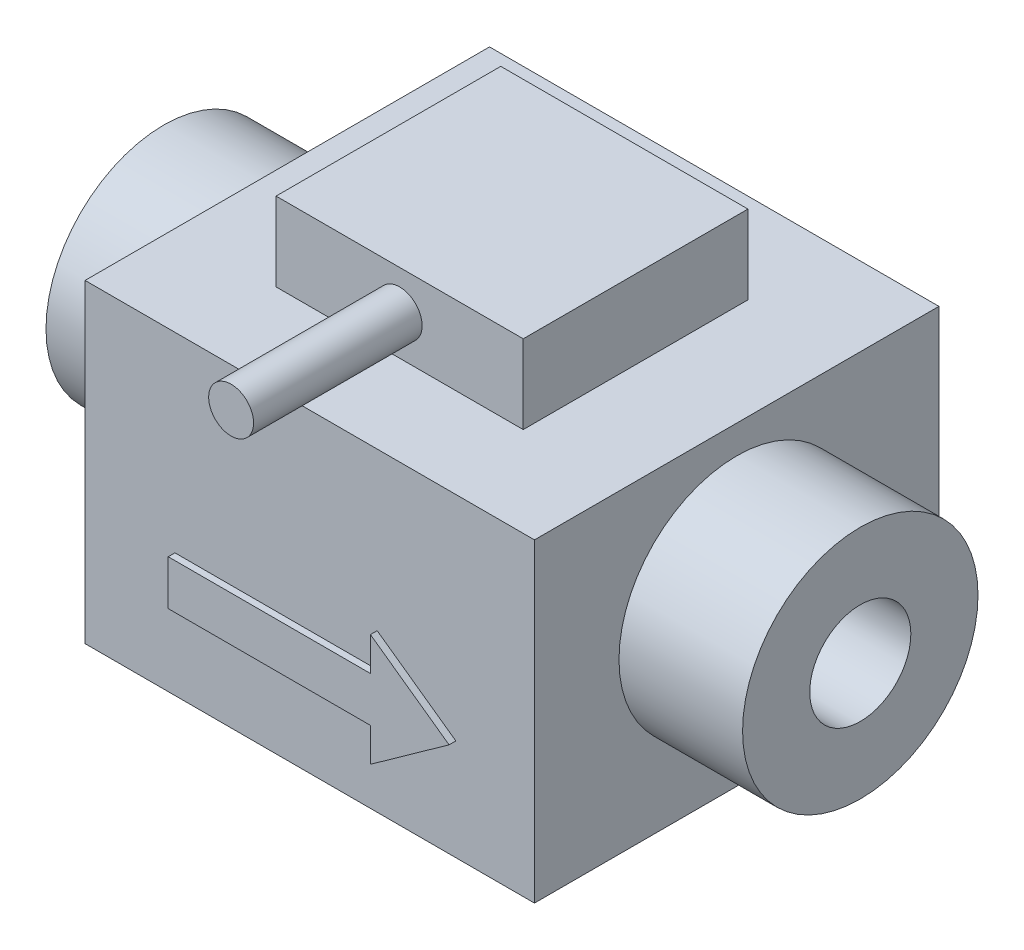
ISO-10303-21;
HEADER;
FILE_DESCRIPTION(('STEP AP214'),'2;1');
FILE_NAME('part.step','',(''),(''),'','','');
FILE_SCHEMA(('AUTOMOTIVE_DESIGN { 1 0 10303 214 1 1 1 1 }'));
ENDSEC;
DATA;
#1=APPLICATION_CONTEXT('core data for automotive mechanical design processes');
#2=APPLICATION_PROTOCOL_DEFINITION('international standard','automotive_design',2000,#1);
#3=PRODUCT_CONTEXT('',#1,'mechanical');
#4=PRODUCT('Part','Part','',(#3));
#5=PRODUCT_RELATED_PRODUCT_CATEGORY('part','',(#4));
#6=PRODUCT_DEFINITION_FORMATION('','',#4);
#7=PRODUCT_DEFINITION_CONTEXT('part definition',#1,'design');
#8=PRODUCT_DEFINITION('design','',#6,#7);
#9=PRODUCT_DEFINITION_SHAPE('','',#8);
#10=(LENGTH_UNIT() NAMED_UNIT(*) SI_UNIT(.MILLI.,.METRE.));
#11=(NAMED_UNIT(*) PLANE_ANGLE_UNIT() SI_UNIT($,.RADIAN.));
#12=(NAMED_UNIT(*) SI_UNIT($,.STERADIAN.) SOLID_ANGLE_UNIT());
#13=UNCERTAINTY_MEASURE_WITH_UNIT(LENGTH_MEASURE(1.E-05),#10,'distance_accuracy_value','');
#14=(GEOMETRIC_REPRESENTATION_CONTEXT(3) GLOBAL_UNCERTAINTY_ASSIGNED_CONTEXT((#13)) GLOBAL_UNIT_ASSIGNED_CONTEXT((#10,
#11,#12)) REPRESENTATION_CONTEXT('',''));
#15=CARTESIAN_POINT('',(0.,0.,0.));
#16=DIRECTION('',(0.,0.,1.));
#17=DIRECTION('',(1.,0.,0.));
#18=AXIS2_PLACEMENT_3D('',#15,#16,#17);
#19=CARTESIAN_POINT('',(-20.,28.,18.));
#20=DIRECTION('',(0.,0.,-1.));
#21=DIRECTION('',(-1.,0.,0.));
#22=AXIS2_PLACEMENT_3D('',#19,#20,#21);
#23=PLANE('',#22);
#24=DIRECTION('',(1.,0.,0.));
#25=VECTOR('',#24,1.);
#26=CARTESIAN_POINT('',(-20.,0.,18.));
#27=LINE('',#26,#25);
#28=CARTESIAN_POINT('',(-20.,0.,18.));
#29=VERTEX_POINT('',#28);
#30=CARTESIAN_POINT('',(20.,0.,18.));
#31=VERTEX_POINT('',#30);
#32=EDGE_CURVE('E242',#29,#31,#27,.T.);
#33=ORIENTED_EDGE('',*,*,#32,.T.);
#34=DIRECTION('',(0.,-1.,0.));
#35=VECTOR('',#34,1.);
#36=CARTESIAN_POINT('',(20.,28.,18.));
#37=LINE('',#36,#35);
#38=CARTESIAN_POINT('',(20.,28.,18.));
#39=VERTEX_POINT('',#38);
#40=EDGE_CURVE('E249',#39,#31,#37,.T.);
#41=ORIENTED_EDGE('',*,*,#40,.F.);
#42=DIRECTION('',(1.,0.,0.));
#43=VECTOR('',#42,1.);
#44=CARTESIAN_POINT('',(-20.,28.,18.));
#45=LINE('',#44,#43);
#46=CARTESIAN_POINT('',(-20.,28.,18.));
#47=VERTEX_POINT('',#46);
#48=EDGE_CURVE('E247',#47,#39,#45,.T.);
#49=ORIENTED_EDGE('',*,*,#48,.F.);
#50=DIRECTION('',(0.,-1.,0.));
#51=VECTOR('',#50,1.);
#52=CARTESIAN_POINT('',(-20.,28.,18.));
#53=LINE('',#52,#51);
#54=EDGE_CURVE('E258',#47,#29,#53,.T.);
#55=ORIENTED_EDGE('',*,*,#54,.T.);
#56=EDGE_LOOP('',(#33,#41,#49,#55));
#57=FACE_BOUND('',#56,.T.);
#58=DIRECTION('',(0.,-1.,0.));
#59=VECTOR('',#58,1.);
#60=CARTESIAN_POINT('',(-12.,11.,18.));
#61=LINE('',#60,#59);
#62=CARTESIAN_POINT('',(-12.,11.,18.));
#63=VERTEX_POINT('',#62);
#64=CARTESIAN_POINT('',(-12.,7.,18.));
#65=VERTEX_POINT('',#64);
#66=EDGE_CURVE('E65',#63,#65,#61,.T.);
#67=ORIENTED_EDGE('',*,*,#66,.F.);
#68=DIRECTION('',(-1.,0.,0.));
#69=VECTOR('',#68,1.);
#70=CARTESIAN_POINT('',(6.,11.,18.));
#71=LINE('',#70,#69);
#72=CARTESIAN_POINT('',(6.,11.,18.));
#73=VERTEX_POINT('',#72);
#74=EDGE_CURVE('E66',#73,#63,#71,.T.);
#75=ORIENTED_EDGE('',*,*,#74,.F.);
#76=DIRECTION('',(0.,-1.,0.));
#77=VECTOR('',#76,1.);
#78=CARTESIAN_POINT('',(6.,14.,18.));
#79=LINE('',#78,#77);
#80=CARTESIAN_POINT('',(6.,14.,18.));
#81=VERTEX_POINT('',#80);
#82=EDGE_CURVE('E576',#81,#73,#79,.T.);
#83=ORIENTED_EDGE('',*,*,#82,.F.);
#84=DIRECTION('',(-0.813733471206735,0.581238193719096,0.));
#85=VECTOR('',#84,1.);
#86=CARTESIAN_POINT('',(13.,9.,18.));
#87=LINE('',#86,#85);
#88=CARTESIAN_POINT('',(13.,9.,18.));
#89=VERTEX_POINT('',#88);
#90=EDGE_CURVE('E604',#89,#81,#87,.T.);
#91=ORIENTED_EDGE('',*,*,#90,.F.);
#92=DIRECTION('',(0.813733471206735,0.581238193719096,0.));
#93=VECTOR('',#92,1.);
#94=CARTESIAN_POINT('',(6.,4.,18.));
#95=LINE('',#94,#93);
#96=CARTESIAN_POINT('',(6.,4.,18.));
#97=VERTEX_POINT('',#96);
#98=EDGE_CURVE('E600',#97,#89,#95,.T.);
#99=ORIENTED_EDGE('',*,*,#98,.F.);
#100=DIRECTION('',(0.,-1.,0.));
#101=VECTOR('',#100,1.);
#102=CARTESIAN_POINT('',(6.,7.,18.));
#103=LINE('',#102,#101);
#104=CARTESIAN_POINT('',(6.,7.,18.));
#105=VERTEX_POINT('',#104);
#106=EDGE_CURVE('E598',#105,#97,#103,.T.);
#107=ORIENTED_EDGE('',*,*,#106,.F.);
#108=DIRECTION('',(1.,0.,0.));
#109=VECTOR('',#108,1.);
#110=CARTESIAN_POINT('',(-12.,7.,18.));
#111=LINE('',#110,#109);
#112=EDGE_CURVE('E602',#65,#105,#111,.T.);
#113=ORIENTED_EDGE('',*,*,#112,.F.);
#114=EDGE_LOOP('',(#67,#75,#83,#91,#99,#107,#113));
#115=FACE_BOUND('',#114,.T.);
#116=ADVANCED_FACE('F50',(#57,#115),#23,.F.);
#117=CARTESIAN_POINT('',(0.,28.,0.));
#118=DIRECTION('',(0.,-1.,0.));
#119=DIRECTION('',(0.,0.,-1.));
#120=AXIS2_PLACEMENT_3D('',#117,#118,#119);
#121=PLANE('',#120);
#122=DIRECTION('',(0.,0.,-1.));
#123=VECTOR('',#122,1.);
#124=CARTESIAN_POINT('',(20.,28.,18.));
#125=LINE('',#124,#123);
#126=CARTESIAN_POINT('',(20.,28.,-18.));
#127=VERTEX_POINT('',#126);
#128=EDGE_CURVE('E239',#39,#127,#125,.T.);
#129=ORIENTED_EDGE('',*,*,#128,.T.);
#130=DIRECTION('',(-1.,0.,0.));
#131=VECTOR('',#130,1.);
#132=CARTESIAN_POINT('',(-20.,28.,-18.));
#133=LINE('',#132,#131);
#134=CARTESIAN_POINT('',(-20.,28.,-18.));
#135=VERTEX_POINT('',#134);
#136=EDGE_CURVE('E243',#127,#135,#133,.T.);
#137=ORIENTED_EDGE('',*,*,#136,.T.);
#138=DIRECTION('',(0.,0.,1.));
#139=VECTOR('',#138,1.);
#140=CARTESIAN_POINT('',(-20.,28.,18.));
#141=LINE('',#140,#139);
#142=EDGE_CURVE('E246',#135,#47,#141,.T.);
#143=ORIENTED_EDGE('',*,*,#142,.T.);
#144=ORIENTED_EDGE('',*,*,#48,.T.);
#145=EDGE_LOOP('',(#129,#137,#143,#144));
#146=FACE_BOUND('',#145,.T.);
#147=DIRECTION('',(0.,0.,1.));
#148=VECTOR('',#147,1.);
#149=CARTESIAN_POINT('',(-11.,28.,-10.));
#150=LINE('',#149,#148);
#151=CARTESIAN_POINT('',(-11.,28.,-10.));
#152=VERTEX_POINT('',#151);
#153=CARTESIAN_POINT('',(-11.,28.,10.));
#154=VERTEX_POINT('',#153);
#155=EDGE_CURVE('E204',#152,#154,#150,.T.);
#156=ORIENTED_EDGE('',*,*,#155,.F.);
#157=DIRECTION('',(-1.,0.,0.));
#158=VECTOR('',#157,1.);
#159=CARTESIAN_POINT('',(11.,28.,-10.));
#160=LINE('',#159,#158);
#161=CARTESIAN_POINT('',(11.,28.,-10.));
#162=VERTEX_POINT('',#161);
#163=EDGE_CURVE('E212',#162,#152,#160,.T.);
#164=ORIENTED_EDGE('',*,*,#163,.F.);
#165=DIRECTION('',(0.,0.,-1.));
#166=VECTOR('',#165,1.);
#167=CARTESIAN_POINT('',(11.,28.,10.));
#168=LINE('',#167,#166);
#169=CARTESIAN_POINT('',(11.,28.,10.));
#170=VERTEX_POINT('',#169);
#171=EDGE_CURVE('E223',#170,#162,#168,.T.);
#172=ORIENTED_EDGE('',*,*,#171,.F.);
#173=DIRECTION('',(1.,0.,0.));
#174=VECTOR('',#173,1.);
#175=CARTESIAN_POINT('',(-11.,28.,10.));
#176=LINE('',#175,#174);
#177=EDGE_CURVE('E220',#154,#170,#176,.T.);
#178=ORIENTED_EDGE('',*,*,#177,.F.);
#179=EDGE_LOOP('',(#156,#164,#172,#178));
#180=FACE_BOUND('',#179,.T.);
#181=ADVANCED_FACE('F285',(#146,#180),#121,.F.);
#182=CARTESIAN_POINT('',(20.,28.,18.));
#183=DIRECTION('',(-1.,0.,0.));
#184=DIRECTION('',(0.,0.,1.));
#185=AXIS2_PLACEMENT_3D('',#182,#183,#184);
#186=PLANE('',#185);
#187=CARTESIAN_POINT('',(20.,15.,0.));
#188=DIRECTION('',(1.,0.,0.));
#189=DIRECTION('',(0.,0.,-1.));
#190=AXIS2_PLACEMENT_3D('',#187,#188,#189);
#191=CIRCLE('',#190,10.4775);
#192=CARTESIAN_POINT('',(20.,15.,-10.4775));
#193=VERTEX_POINT('',#192);
#194=EDGE_CURVE('E54',#193,#193,#191,.T.);
#195=ORIENTED_EDGE('',*,*,#194,.F.);
#196=EDGE_LOOP('',(#195));
#197=FACE_BOUND('',#196,.T.);
#198=DIRECTION('',(0.,0.,-1.));
#199=VECTOR('',#198,1.);
#200=CARTESIAN_POINT('',(20.,0.,18.));
#201=LINE('',#200,#199);
#202=CARTESIAN_POINT('',(20.,0.,-18.));
#203=VERTEX_POINT('',#202);
#204=EDGE_CURVE('E237',#31,#203,#201,.T.);
#205=ORIENTED_EDGE('',*,*,#204,.T.);
#206=DIRECTION('',(0.,-1.,0.));
#207=VECTOR('',#206,1.);
#208=CARTESIAN_POINT('',(20.,28.,-18.));
#209=LINE('',#208,#207);
#210=EDGE_CURVE('E200',#127,#203,#209,.T.);
#211=ORIENTED_EDGE('',*,*,#210,.F.);
#212=ORIENTED_EDGE('',*,*,#128,.F.);
#213=ORIENTED_EDGE('',*,*,#40,.T.);
#214=EDGE_LOOP('',(#205,#211,#212,#213));
#215=FACE_BOUND('',#214,.T.);
#216=ADVANCED_FACE('F47',(#197,#215),#186,.F.);
#217=CARTESIAN_POINT('',(-20.,28.,-18.));
#218=DIRECTION('',(0.,0.,1.));
#219=DIRECTION('',(1.,0.,0.));
#220=AXIS2_PLACEMENT_3D('',#217,#218,#219);
#221=PLANE('',#220);
#222=DIRECTION('',(-1.,0.,0.));
#223=VECTOR('',#222,1.);
#224=CARTESIAN_POINT('',(-20.,0.,-18.));
#225=LINE('',#224,#223);
#226=CARTESIAN_POINT('',(-20.,0.,-18.));
#227=VERTEX_POINT('',#226);
#228=EDGE_CURVE('E254',#203,#227,#225,.T.);
#229=ORIENTED_EDGE('',*,*,#228,.T.);
#230=DIRECTION('',(0.,-1.,0.));
#231=VECTOR('',#230,1.);
#232=CARTESIAN_POINT('',(-20.,28.,-18.));
#233=LINE('',#232,#231);
#234=EDGE_CURVE('E264',#135,#227,#233,.T.);
#235=ORIENTED_EDGE('',*,*,#234,.F.);
#236=ORIENTED_EDGE('',*,*,#136,.F.);
#237=ORIENTED_EDGE('',*,*,#210,.T.);
#238=EDGE_LOOP('',(#229,#235,#236,#237));
#239=FACE_BOUND('',#238,.T.);
#240=ADVANCED_FACE('F268',(#239),#221,.F.);
#241=CARTESIAN_POINT('',(-20.,28.,18.));
#242=DIRECTION('',(1.,0.,0.));
#243=DIRECTION('',(0.,0.,-1.));
#244=AXIS2_PLACEMENT_3D('',#241,#242,#243);
#245=PLANE('',#244);
#246=CARTESIAN_POINT('',(-20.,15.,0.));
#247=DIRECTION('',(1.,0.,0.));
#248=DIRECTION('',(0.,0.,-1.));
#249=AXIS2_PLACEMENT_3D('',#246,#247,#248);
#250=CIRCLE('',#249,10.4775);
#251=CARTESIAN_POINT('',(-20.,15.,-10.4775));
#252=VERTEX_POINT('',#251);
#253=EDGE_CURVE('E202',#252,#252,#250,.T.);
#254=ORIENTED_EDGE('',*,*,#253,.T.);
#255=EDGE_LOOP('',(#254));
#256=FACE_BOUND('',#255,.T.);
#257=DIRECTION('',(0.,0.,1.));
#258=VECTOR('',#257,1.);
#259=CARTESIAN_POINT('',(-20.,0.,18.));
#260=LINE('',#259,#258);
#261=EDGE_CURVE('E253',#227,#29,#260,.T.);
#262=ORIENTED_EDGE('',*,*,#261,.T.);
#263=ORIENTED_EDGE('',*,*,#54,.F.);
#264=ORIENTED_EDGE('',*,*,#142,.F.);
#265=ORIENTED_EDGE('',*,*,#234,.T.);
#266=EDGE_LOOP('',(#262,#263,#264,#265));
#267=FACE_BOUND('',#266,.T.);
#268=ADVANCED_FACE('F278',(#256,#267),#245,.F.);
#269=CARTESIAN_POINT('',(0.,0.,0.));
#270=DIRECTION('',(0.,-1.,0.));
#271=DIRECTION('',(0.,0.,-1.));
#272=AXIS2_PLACEMENT_3D('',#269,#270,#271);
#273=PLANE('',#272);
#274=ORIENTED_EDGE('',*,*,#204,.F.);
#275=ORIENTED_EDGE('',*,*,#32,.F.);
#276=ORIENTED_EDGE('',*,*,#261,.F.);
#277=ORIENTED_EDGE('',*,*,#228,.F.);
#278=EDGE_LOOP('',(#274,#275,#276,#277));
#279=FACE_BOUND('',#278,.T.);
#280=ADVANCED_FACE('F277',(#279),#273,.T.);
#281=CARTESIAN_POINT('',(-11.,35.,-10.));
#282=DIRECTION('',(1.,0.,0.));
#283=DIRECTION('',(0.,0.,-1.));
#284=AXIS2_PLACEMENT_3D('',#281,#282,#283);
#285=PLANE('',#284);
#286=ORIENTED_EDGE('',*,*,#155,.T.);
#287=DIRECTION('',(0.,-1.,0.));
#288=VECTOR('',#287,1.);
#289=CARTESIAN_POINT('',(-11.,35.,10.));
#290=LINE('',#289,#288);
#291=CARTESIAN_POINT('',(-11.,35.,10.));
#292=VERTEX_POINT('',#291);
#293=EDGE_CURVE('E236',#292,#154,#290,.T.);
#294=ORIENTED_EDGE('',*,*,#293,.F.);
#295=DIRECTION('',(0.,0.,1.));
#296=VECTOR('',#295,1.);
#297=CARTESIAN_POINT('',(-11.,35.,-10.));
#298=LINE('',#297,#296);
#299=CARTESIAN_POINT('',(-11.,35.,-10.));
#300=VERTEX_POINT('',#299);
#301=EDGE_CURVE('E210',#300,#292,#298,.T.);
#302=ORIENTED_EDGE('',*,*,#301,.F.);
#303=DIRECTION('',(0.,-1.,0.));
#304=VECTOR('',#303,1.);
#305=CARTESIAN_POINT('',(-11.,35.,-10.));
#306=LINE('',#305,#304);
#307=EDGE_CURVE('E217',#300,#152,#306,.T.);
#308=ORIENTED_EDGE('',*,*,#307,.T.);
#309=EDGE_LOOP('',(#286,#294,#302,#308));
#310=FACE_BOUND('',#309,.T.);
#311=ADVANCED_FACE('F300',(#310),#285,.F.);
#312=CARTESIAN_POINT('',(-11.,35.,10.));
#313=DIRECTION('',(0.,0.,-1.));
#314=DIRECTION('',(-1.,0.,0.));
#315=AXIS2_PLACEMENT_3D('',#312,#313,#314);
#316=PLANE('',#315);
#317=CARTESIAN_POINT('',(0.,31.5,10.));
#318=DIRECTION('',(0.,0.,-1.));
#319=DIRECTION('',(-1.,0.,0.));
#320=AXIS2_PLACEMENT_3D('',#317,#318,#319);
#321=CIRCLE('',#320,2.);
#322=CARTESIAN_POINT('',(-2.,31.5,10.));
#323=VERTEX_POINT('',#322);
#324=EDGE_CURVE('E11',#323,#323,#321,.F.);
#325=ORIENTED_EDGE('',*,*,#324,.F.);
#326=EDGE_LOOP('',(#325));
#327=FACE_BOUND('',#326,.T.);
#328=ORIENTED_EDGE('',*,*,#177,.T.);
#329=DIRECTION('',(0.,-1.,0.));
#330=VECTOR('',#329,1.);
#331=CARTESIAN_POINT('',(11.,35.,10.));
#332=LINE('',#331,#330);
#333=CARTESIAN_POINT('',(11.,35.,10.));
#334=VERTEX_POINT('',#333);
#335=EDGE_CURVE('E231',#334,#170,#332,.T.);
#336=ORIENTED_EDGE('',*,*,#335,.F.);
#337=DIRECTION('',(1.,0.,0.));
#338=VECTOR('',#337,1.);
#339=CARTESIAN_POINT('',(-11.,35.,10.));
#340=LINE('',#339,#338);
#341=EDGE_CURVE('E208',#292,#334,#340,.T.);
#342=ORIENTED_EDGE('',*,*,#341,.F.);
#343=ORIENTED_EDGE('',*,*,#293,.T.);
#344=EDGE_LOOP('',(#328,#336,#342,#343));
#345=FACE_BOUND('',#344,.T.);
#346=ADVANCED_FACE('F304',(#327,#345),#316,.F.);
#347=CARTESIAN_POINT('',(11.,35.,10.));
#348=DIRECTION('',(-1.,0.,0.));
#349=DIRECTION('',(0.,0.,1.));
#350=AXIS2_PLACEMENT_3D('',#347,#348,#349);
#351=PLANE('',#350);
#352=ORIENTED_EDGE('',*,*,#171,.T.);
#353=DIRECTION('',(0.,-1.,0.));
#354=VECTOR('',#353,1.);
#355=CARTESIAN_POINT('',(11.,35.,-10.));
#356=LINE('',#355,#354);
#357=CARTESIAN_POINT('',(11.,35.,-10.));
#358=VERTEX_POINT('',#357);
#359=EDGE_CURVE('E229',#358,#162,#356,.T.);
#360=ORIENTED_EDGE('',*,*,#359,.F.);
#361=DIRECTION('',(0.,0.,-1.));
#362=VECTOR('',#361,1.);
#363=CARTESIAN_POINT('',(11.,35.,10.));
#364=LINE('',#363,#362);
#365=EDGE_CURVE('E214',#334,#358,#364,.T.);
#366=ORIENTED_EDGE('',*,*,#365,.F.);
#367=ORIENTED_EDGE('',*,*,#335,.T.);
#368=EDGE_LOOP('',(#352,#360,#366,#367));
#369=FACE_BOUND('',#368,.T.);
#370=ADVANCED_FACE('F303',(#369),#351,.F.);
#371=CARTESIAN_POINT('',(11.,35.,-10.));
#372=DIRECTION('',(0.,0.,1.));
#373=DIRECTION('',(1.,0.,0.));
#374=AXIS2_PLACEMENT_3D('',#371,#372,#373);
#375=PLANE('',#374);
#376=ORIENTED_EDGE('',*,*,#163,.T.);
#377=ORIENTED_EDGE('',*,*,#307,.F.);
#378=DIRECTION('',(-1.,0.,0.));
#379=VECTOR('',#378,1.);
#380=CARTESIAN_POINT('',(11.,35.,-10.));
#381=LINE('',#380,#379);
#382=EDGE_CURVE('E213',#358,#300,#381,.T.);
#383=ORIENTED_EDGE('',*,*,#382,.F.);
#384=ORIENTED_EDGE('',*,*,#359,.T.);
#385=EDGE_LOOP('',(#376,#377,#383,#384));
#386=FACE_BOUND('',#385,.T.);
#387=ADVANCED_FACE('F291',(#386),#375,.F.);
#388=CARTESIAN_POINT('',(0.,35.,0.));
#389=DIRECTION('',(0.,1.,0.));
#390=DIRECTION('',(0.,0.,1.));
#391=AXIS2_PLACEMENT_3D('',#388,#389,#390);
#392=PLANE('',#391);
#393=ORIENTED_EDGE('',*,*,#301,.T.);
#394=ORIENTED_EDGE('',*,*,#341,.T.);
#395=ORIENTED_EDGE('',*,*,#365,.T.);
#396=ORIENTED_EDGE('',*,*,#382,.T.);
#397=EDGE_LOOP('',(#393,#394,#395,#396));
#398=FACE_BOUND('',#397,.T.);
#399=ADVANCED_FACE('F299',(#398),#392,.T.);
#400=CARTESIAN_POINT('',(-20.,15.,0.));
#401=DIRECTION('',(-1.,0.,0.));
#402=DIRECTION('',(0.,0.,1.));
#403=AXIS2_PLACEMENT_3D('',#400,#401,#402);
#404=CYLINDRICAL_SURFACE('',#403,10.4775);
#405=ORIENTED_EDGE('',*,*,#253,.F.);
#406=EDGE_LOOP('',(#405));
#407=FACE_BOUND('',#406,.T.);
#408=CARTESIAN_POINT('',(-31.,15.,0.));
#409=DIRECTION('',(1.,0.,0.));
#410=DIRECTION('',(0.,0.,-1.));
#411=AXIS2_PLACEMENT_3D('',#408,#409,#410);
#412=CIRCLE('',#411,10.4775);
#413=CARTESIAN_POINT('',(-31.,15.,-10.4775));
#414=VERTEX_POINT('',#413);
#415=EDGE_CURVE('E197',#414,#414,#412,.T.);
#416=ORIENTED_EDGE('',*,*,#415,.T.);
#417=EDGE_LOOP('',(#416));
#418=FACE_BOUND('',#417,.T.);
#419=ADVANCED_FACE('F355',(#407,#418),#404,.T.);
#420=CARTESIAN_POINT('',(-31.,15.,0.));
#421=DIRECTION('',(1.,0.,0.));
#422=DIRECTION('',(0.,0.,-1.));
#423=AXIS2_PLACEMENT_3D('',#420,#421,#422);
#424=PLANE('',#423);
#425=CARTESIAN_POINT('',(-31.,15.,0.));
#426=DIRECTION('',(1.,0.,0.));
#427=DIRECTION('',(0.,0.,-1.));
#428=AXIS2_PLACEMENT_3D('',#425,#426,#427);
#429=CIRCLE('',#428,4.5);
#430=CARTESIAN_POINT('',(-31.,15.,-4.5));
#431=VERTEX_POINT('',#430);
#432=EDGE_CURVE('E187',#431,#431,#429,.T.);
#433=ORIENTED_EDGE('',*,*,#432,.T.);
#434=EDGE_LOOP('',(#433));
#435=FACE_BOUND('',#434,.T.);
#436=ORIENTED_EDGE('',*,*,#415,.F.);
#437=EDGE_LOOP('',(#436));
#438=FACE_BOUND('',#437,.T.);
#439=ADVANCED_FACE('F345',(#435,#438),#424,.F.);
#440=CARTESIAN_POINT('',(31.,15.,0.));
#441=DIRECTION('',(-1.,0.,0.));
#442=DIRECTION('',(0.,0.,1.));
#443=AXIS2_PLACEMENT_3D('',#440,#441,#442);
#444=CYLINDRICAL_SURFACE('',#443,10.4775);
#445=CARTESIAN_POINT('',(31.,15.,0.));
#446=DIRECTION('',(1.,0.,0.));
#447=DIRECTION('',(0.,0.,-1.));
#448=AXIS2_PLACEMENT_3D('',#445,#446,#447);
#449=CIRCLE('',#448,10.4775);
#450=CARTESIAN_POINT('',(31.,15.,-10.4775));
#451=VERTEX_POINT('',#450);
#452=EDGE_CURVE('E195',#451,#451,#449,.T.);
#453=ORIENTED_EDGE('',*,*,#452,.F.);
#454=EDGE_LOOP('',(#453));
#455=FACE_BOUND('',#454,.T.);
#456=ORIENTED_EDGE('',*,*,#194,.T.);
#457=EDGE_LOOP('',(#456));
#458=FACE_BOUND('',#457,.T.);
#459=ADVANCED_FACE('F338',(#455,#458),#444,.T.);
#460=CARTESIAN_POINT('',(31.,15.,0.));
#461=DIRECTION('',(1.,0.,0.));
#462=DIRECTION('',(0.,0.,-1.));
#463=AXIS2_PLACEMENT_3D('',#460,#461,#462);
#464=PLANE('',#463);
#465=CARTESIAN_POINT('',(31.,15.,0.));
#466=DIRECTION('',(1.,0.,0.));
#467=DIRECTION('',(0.,0.,-1.));
#468=AXIS2_PLACEMENT_3D('',#465,#466,#467);
#469=CIRCLE('',#468,4.5);
#470=CARTESIAN_POINT('',(31.,15.,-4.5));
#471=VERTEX_POINT('',#470);
#472=EDGE_CURVE('E180',#471,#471,#469,.T.);
#473=ORIENTED_EDGE('',*,*,#472,.F.);
#474=EDGE_LOOP('',(#473));
#475=FACE_BOUND('',#474,.T.);
#476=ORIENTED_EDGE('',*,*,#452,.T.);
#477=EDGE_LOOP('',(#476));
#478=FACE_BOUND('',#477,.T.);
#479=ADVANCED_FACE('F342',(#475,#478),#464,.T.);
#480=CARTESIAN_POINT('',(-23.,15.,0.));
#481=DIRECTION('',(-1.,0.,0.));
#482=DIRECTION('',(0.,0.,1.));
#483=AXIS2_PLACEMENT_3D('',#480,#481,#482);
#484=CYLINDRICAL_SURFACE('',#483,4.5);
#485=CARTESIAN_POINT('',(-23.,15.,0.));
#486=DIRECTION('',(1.,0.,0.));
#487=DIRECTION('',(0.,0.,-1.));
#488=AXIS2_PLACEMENT_3D('',#485,#486,#487);
#489=CIRCLE('',#488,4.5);
#490=CARTESIAN_POINT('',(-23.,15.,-4.5));
#491=VERTEX_POINT('',#490);
#492=EDGE_CURVE('E186',#491,#491,#489,.T.);
#493=ORIENTED_EDGE('',*,*,#492,.T.);
#494=EDGE_LOOP('',(#493));
#495=FACE_BOUND('',#494,.T.);
#496=ORIENTED_EDGE('',*,*,#432,.F.);
#497=EDGE_LOOP('',(#496));
#498=FACE_BOUND('',#497,.T.);
#499=ADVANCED_FACE('F348',(#495,#498),#484,.F.);
#500=CARTESIAN_POINT('',(-23.,15.,0.));
#501=DIRECTION('',(1.,0.,0.));
#502=DIRECTION('',(0.,0.,-1.));
#503=AXIS2_PLACEMENT_3D('',#500,#501,#502);
#504=PLANE('',#503);
#505=ORIENTED_EDGE('',*,*,#492,.F.);
#506=EDGE_LOOP('',(#505));
#507=FACE_BOUND('',#506,.T.);
#508=ADVANCED_FACE('F411',(#507),#504,.F.);
#509=CARTESIAN_POINT('',(23.,15.,0.));
#510=DIRECTION('',(1.,0.,0.));
#511=DIRECTION('',(0.,0.,-1.));
#512=AXIS2_PLACEMENT_3D('',#509,#510,#511);
#513=CYLINDRICAL_SURFACE('',#512,4.5);
#514=CARTESIAN_POINT('',(23.,15.,0.));
#515=DIRECTION('',(1.,0.,0.));
#516=DIRECTION('',(0.,0.,-1.));
#517=AXIS2_PLACEMENT_3D('',#514,#515,#516);
#518=CIRCLE('',#517,4.5);
#519=CARTESIAN_POINT('',(23.,15.,-4.5));
#520=VERTEX_POINT('',#519);
#521=EDGE_CURVE('E182',#520,#520,#518,.T.);
#522=ORIENTED_EDGE('',*,*,#521,.F.);
#523=EDGE_LOOP('',(#522));
#524=FACE_BOUND('',#523,.T.);
#525=ORIENTED_EDGE('',*,*,#472,.T.);
#526=EDGE_LOOP('',(#525));
#527=FACE_BOUND('',#526,.T.);
#528=ADVANCED_FACE('F419',(#524,#527),#513,.F.);
#529=CARTESIAN_POINT('',(23.,15.,0.));
#530=DIRECTION('',(1.,0.,0.));
#531=DIRECTION('',(0.,0.,-1.));
#532=AXIS2_PLACEMENT_3D('',#529,#530,#531);
#533=PLANE('',#532);
#534=ORIENTED_EDGE('',*,*,#521,.T.);
#535=EDGE_LOOP('',(#534));
#536=FACE_BOUND('',#535,.T.);
#537=ADVANCED_FACE('F426',(#536),#533,.T.);
#538=CARTESIAN_POINT('',(0.,31.5,25.));
#539=DIRECTION('',(0.,0.,-1.));
#540=DIRECTION('',(-1.,0.,0.));
#541=AXIS2_PLACEMENT_3D('',#538,#539,#540);
#542=CYLINDRICAL_SURFACE('',#541,2.);
#543=CARTESIAN_POINT('',(0.,31.5,25.));
#544=DIRECTION('',(0.,0.,1.));
#545=DIRECTION('',(1.,0.,0.));
#546=AXIS2_PLACEMENT_3D('',#543,#544,#545);
#547=CIRCLE('',#546,2.);
#548=CARTESIAN_POINT('',(2.,31.5,25.));
#549=VERTEX_POINT('',#548);
#550=EDGE_CURVE('E172',#549,#549,#547,.T.);
#551=ORIENTED_EDGE('',*,*,#550,.F.);
#552=EDGE_LOOP('',(#551));
#553=FACE_BOUND('',#552,.T.);
#554=ORIENTED_EDGE('',*,*,#324,.T.);
#555=EDGE_LOOP('',(#554));
#556=FACE_BOUND('',#555,.T.);
#557=ADVANCED_FACE('F440',(#553,#556),#542,.T.);
#558=CARTESIAN_POINT('',(0.,31.5,25.));
#559=DIRECTION('',(0.,0.,1.));
#560=DIRECTION('',(1.,0.,0.));
#561=AXIS2_PLACEMENT_3D('',#558,#559,#560);
#562=PLANE('',#561);
#563=ORIENTED_EDGE('',*,*,#550,.T.);
#564=EDGE_LOOP('',(#563));
#565=FACE_BOUND('',#564,.T.);
#566=ADVANCED_FACE('F450',(#565),#562,.T.);
#567=CARTESIAN_POINT('',(-12.,11.,18.6));
#568=DIRECTION('',(1.,0.,0.));
#569=DIRECTION('',(0.,0.,-1.));
#570=AXIS2_PLACEMENT_3D('',#567,#568,#569);
#571=PLANE('',#570);
#572=ORIENTED_EDGE('',*,*,#66,.T.);
#573=DIRECTION('',(0.,0.,-1.));
#574=VECTOR('',#573,1.);
#575=CARTESIAN_POINT('',(-12.,7.,18.6));
#576=LINE('',#575,#574);
#577=CARTESIAN_POINT('',(-12.,7.,18.6));
#578=VERTEX_POINT('',#577);
#579=EDGE_CURVE('E160',#578,#65,#576,.T.);
#580=ORIENTED_EDGE('',*,*,#579,.F.);
#581=DIRECTION('',(0.,-1.,0.));
#582=VECTOR('',#581,1.);
#583=CARTESIAN_POINT('',(-12.,11.,18.6));
#584=LINE('',#583,#582);
#585=CARTESIAN_POINT('',(-12.,11.,18.6));
#586=VERTEX_POINT('',#585);
#587=EDGE_CURVE('E161',#586,#578,#584,.T.);
#588=ORIENTED_EDGE('',*,*,#587,.F.);
#589=DIRECTION('',(0.,0.,-1.));
#590=VECTOR('',#589,1.);
#591=CARTESIAN_POINT('',(-12.,11.,18.6));
#592=LINE('',#591,#590);
#593=EDGE_CURVE('E577',#586,#63,#592,.T.);
#594=ORIENTED_EDGE('',*,*,#593,.T.);
#595=EDGE_LOOP('',(#572,#580,#588,#594));
#596=FACE_BOUND('',#595,.T.);
#597=ADVANCED_FACE('F173',(#596),#571,.F.);
#598=CARTESIAN_POINT('',(-12.,7.,18.6));
#599=DIRECTION('',(0.,1.,0.));
#600=DIRECTION('',(0.,0.,1.));
#601=AXIS2_PLACEMENT_3D('',#598,#599,#600);
#602=PLANE('',#601);
#603=ORIENTED_EDGE('',*,*,#112,.T.);
#604=DIRECTION('',(0.,0.,-1.));
#605=VECTOR('',#604,1.);
#606=CARTESIAN_POINT('',(6.,7.,18.6));
#607=LINE('',#606,#605);
#608=CARTESIAN_POINT('',(6.,7.,18.6));
#609=VERTEX_POINT('',#608);
#610=EDGE_CURVE('E159',#609,#105,#607,.T.);
#611=ORIENTED_EDGE('',*,*,#610,.F.);
#612=DIRECTION('',(1.,0.,0.));
#613=VECTOR('',#612,1.);
#614=CARTESIAN_POINT('',(-12.,7.,18.6));
#615=LINE('',#614,#613);
#616=EDGE_CURVE('E152',#578,#609,#615,.T.);
#617=ORIENTED_EDGE('',*,*,#616,.F.);
#618=ORIENTED_EDGE('',*,*,#579,.T.);
#619=EDGE_LOOP('',(#603,#611,#617,#618));
#620=FACE_BOUND('',#619,.T.);
#621=ADVANCED_FACE('F155',(#620),#602,.F.);
#622=CARTESIAN_POINT('',(6.,7.,18.6));
#623=DIRECTION('',(1.,0.,0.));
#624=DIRECTION('',(0.,0.,-1.));
#625=AXIS2_PLACEMENT_3D('',#622,#623,#624);
#626=PLANE('',#625);
#627=ORIENTED_EDGE('',*,*,#106,.T.);
#628=DIRECTION('',(0.,0.,-1.));
#629=VECTOR('',#628,1.);
#630=CARTESIAN_POINT('',(6.,4.,18.6));
#631=LINE('',#630,#629);
#632=CARTESIAN_POINT('',(6.,4.,18.6));
#633=VERTEX_POINT('',#632);
#634=EDGE_CURVE('E177',#633,#97,#631,.T.);
#635=ORIENTED_EDGE('',*,*,#634,.F.);
#636=DIRECTION('',(0.,-1.,0.));
#637=VECTOR('',#636,1.);
#638=CARTESIAN_POINT('',(6.,7.,18.6));
#639=LINE('',#638,#637);
#640=EDGE_CURVE('E162',#609,#633,#639,.T.);
#641=ORIENTED_EDGE('',*,*,#640,.F.);
#642=ORIENTED_EDGE('',*,*,#610,.T.);
#643=EDGE_LOOP('',(#627,#635,#641,#642));
#644=FACE_BOUND('',#643,.T.);
#645=ADVANCED_FACE('F485',(#644),#626,.F.);
#646=CARTESIAN_POINT('',(6.,4.,18.6));
#647=DIRECTION('',(-0.581238193719096,0.813733471206735,0.));
#648=DIRECTION('',(-0.813733471206735,-0.581238193719096,0.));
#649=AXIS2_PLACEMENT_3D('',#646,#647,#648);
#650=PLANE('',#649);
#651=ORIENTED_EDGE('',*,*,#98,.T.);
#652=DIRECTION('',(0.,0.,-1.));
#653=VECTOR('',#652,1.);
#654=CARTESIAN_POINT('',(13.,9.,18.6));
#655=LINE('',#654,#653);
#656=CARTESIAN_POINT('',(13.,9.,18.6));
#657=VERTEX_POINT('',#656);
#658=EDGE_CURVE('E590',#657,#89,#655,.T.);
#659=ORIENTED_EDGE('',*,*,#658,.F.);
#660=DIRECTION('',(0.813733471206735,0.581238193719096,0.));
#661=VECTOR('',#660,1.);
#662=CARTESIAN_POINT('',(6.,4.,18.6));
#663=LINE('',#662,#661);
#664=EDGE_CURVE('E596',#633,#657,#663,.T.);
#665=ORIENTED_EDGE('',*,*,#664,.F.);
#666=ORIENTED_EDGE('',*,*,#634,.T.);
#667=EDGE_LOOP('',(#651,#659,#665,#666));
#668=FACE_BOUND('',#667,.T.);
#669=ADVANCED_FACE('F491',(#668),#650,.F.);
#670=CARTESIAN_POINT('',(13.,9.,18.6));
#671=DIRECTION('',(-0.581238193719096,-0.813733471206735,0.));
#672=DIRECTION('',(0.813733471206735,-0.581238193719096,0.));
#673=AXIS2_PLACEMENT_3D('',#670,#671,#672);
#674=PLANE('',#673);
#675=ORIENTED_EDGE('',*,*,#90,.T.);
#676=DIRECTION('',(0.,0.,-1.));
#677=VECTOR('',#676,1.);
#678=CARTESIAN_POINT('',(6.,14.,18.6));
#679=LINE('',#678,#677);
#680=CARTESIAN_POINT('',(6.,14.,18.6));
#681=VERTEX_POINT('',#680);
#682=EDGE_CURVE('E585',#681,#81,#679,.T.);
#683=ORIENTED_EDGE('',*,*,#682,.F.);
#684=DIRECTION('',(-0.813733471206735,0.581238193719096,0.));
#685=VECTOR('',#684,1.);
#686=CARTESIAN_POINT('',(13.,9.,18.6));
#687=LINE('',#686,#685);
#688=EDGE_CURVE('E615',#657,#681,#687,.T.);
#689=ORIENTED_EDGE('',*,*,#688,.F.);
#690=ORIENTED_EDGE('',*,*,#658,.T.);
#691=EDGE_LOOP('',(#675,#683,#689,#690));
#692=FACE_BOUND('',#691,.T.);
#693=ADVANCED_FACE('F504',(#692),#674,.F.);
#694=CARTESIAN_POINT('',(6.,14.,18.6));
#695=DIRECTION('',(1.,0.,0.));
#696=DIRECTION('',(0.,0.,-1.));
#697=AXIS2_PLACEMENT_3D('',#694,#695,#696);
#698=PLANE('',#697);
#699=ORIENTED_EDGE('',*,*,#82,.T.);
#700=DIRECTION('',(0.,0.,-1.));
#701=VECTOR('',#700,1.);
#702=CARTESIAN_POINT('',(6.,11.,18.6));
#703=LINE('',#702,#701);
#704=CARTESIAN_POINT('',(6.,11.,18.6));
#705=VERTEX_POINT('',#704);
#706=EDGE_CURVE('E579',#705,#73,#703,.T.);
#707=ORIENTED_EDGE('',*,*,#706,.F.);
#708=DIRECTION('',(0.,-1.,0.));
#709=VECTOR('',#708,1.);
#710=CARTESIAN_POINT('',(6.,14.,18.6));
#711=LINE('',#710,#709);
#712=EDGE_CURVE('E581',#681,#705,#711,.T.);
#713=ORIENTED_EDGE('',*,*,#712,.F.);
#714=ORIENTED_EDGE('',*,*,#682,.T.);
#715=EDGE_LOOP('',(#699,#707,#713,#714));
#716=FACE_BOUND('',#715,.T.);
#717=ADVANCED_FACE('F520',(#716),#698,.F.);
#718=CARTESIAN_POINT('',(6.,11.,18.6));
#719=DIRECTION('',(0.,-1.,0.));
#720=DIRECTION('',(0.,0.,-1.));
#721=AXIS2_PLACEMENT_3D('',#718,#719,#720);
#722=PLANE('',#721);
#723=ORIENTED_EDGE('',*,*,#74,.T.);
#724=ORIENTED_EDGE('',*,*,#593,.F.);
#725=DIRECTION('',(-1.,0.,0.));
#726=VECTOR('',#725,1.);
#727=CARTESIAN_POINT('',(6.,11.,18.6));
#728=LINE('',#727,#726);
#729=EDGE_CURVE('E166',#705,#586,#728,.T.);
#730=ORIENTED_EDGE('',*,*,#729,.F.);
#731=ORIENTED_EDGE('',*,*,#706,.T.);
#732=EDGE_LOOP('',(#723,#724,#730,#731));
#733=FACE_BOUND('',#732,.T.);
#734=ADVANCED_FACE('F529',(#733),#722,.F.);
#735=CARTESIAN_POINT('',(0.,0.,18.6));
#736=DIRECTION('',(0.,0.,1.));
#737=DIRECTION('',(1.,0.,0.));
#738=AXIS2_PLACEMENT_3D('',#735,#736,#737);
#739=PLANE('',#738);
#740=ORIENTED_EDGE('',*,*,#587,.T.);
#741=ORIENTED_EDGE('',*,*,#616,.T.);
#742=ORIENTED_EDGE('',*,*,#640,.T.);
#743=ORIENTED_EDGE('',*,*,#664,.T.);
#744=ORIENTED_EDGE('',*,*,#688,.T.);
#745=ORIENTED_EDGE('',*,*,#712,.T.);
#746=ORIENTED_EDGE('',*,*,#729,.T.);
#747=EDGE_LOOP('',(#740,#741,#742,#743,#744,#745,#746));
#748=FACE_BOUND('',#747,.T.);
#749=ADVANCED_FACE('F168',(#748),#739,.T.);
#750=CLOSED_SHELL('',(#116,#181,#216,#240,#268,#280,#311,#346,#370,#387,#399,#419,#439,#459,
#479,#499,#508,#528,#537,#557,#566,#597,#621,#645,#669,#693,#717,#734,#749));
#751=MANIFOLD_SOLID_BREP('B2',#750);
#752=ADVANCED_BREP_SHAPE_REPRESENTATION('',(#18,#751),#14);
#753=SHAPE_DEFINITION_REPRESENTATION(#9,#752);
ENDSEC;
END-ISO-10303-21;
